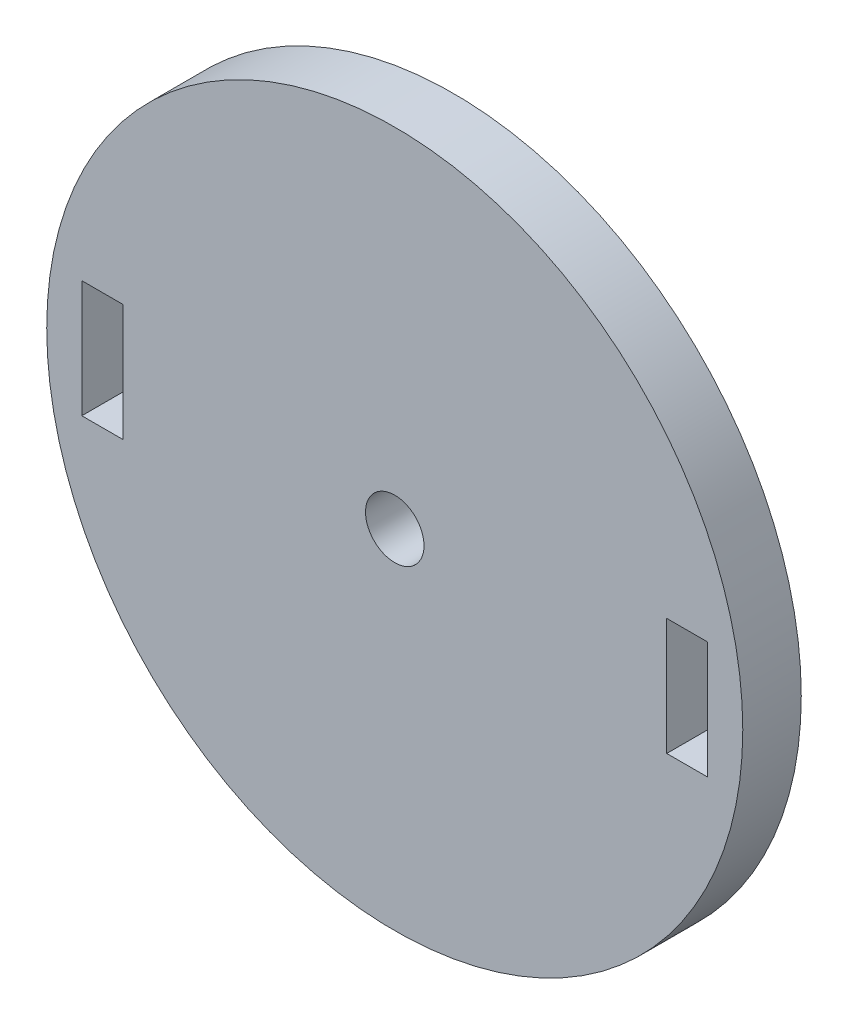
ISO-10303-21;
HEADER;
FILE_DESCRIPTION(('STEP AP214'),'2;1');
FILE_NAME('part.step','',(''),(''),'','','');
FILE_SCHEMA(('AUTOMOTIVE_DESIGN { 1 0 10303 214 1 1 1 1 }'));
ENDSEC;
DATA;
#1=APPLICATION_CONTEXT('core data for automotive mechanical design processes');
#2=APPLICATION_PROTOCOL_DEFINITION('international standard','automotive_design',2000,#1);
#3=PRODUCT_CONTEXT('',#1,'mechanical');
#4=PRODUCT('Part','Part','',(#3));
#5=PRODUCT_RELATED_PRODUCT_CATEGORY('part','',(#4));
#6=PRODUCT_DEFINITION_FORMATION('','',#4);
#7=PRODUCT_DEFINITION_CONTEXT('part definition',#1,'design');
#8=PRODUCT_DEFINITION('design','',#6,#7);
#9=PRODUCT_DEFINITION_SHAPE('','',#8);
#10=(LENGTH_UNIT() NAMED_UNIT(*) SI_UNIT(.MILLI.,.METRE.));
#11=(NAMED_UNIT(*) PLANE_ANGLE_UNIT() SI_UNIT($,.RADIAN.));
#12=(NAMED_UNIT(*) SI_UNIT($,.STERADIAN.) SOLID_ANGLE_UNIT());
#13=UNCERTAINTY_MEASURE_WITH_UNIT(LENGTH_MEASURE(1.E-05),#10,'distance_accuracy_value','');
#14=(GEOMETRIC_REPRESENTATION_CONTEXT(3) GLOBAL_UNCERTAINTY_ASSIGNED_CONTEXT((#13)) GLOBAL_UNIT_ASSIGNED_CONTEXT((#10,
#11,#12)) REPRESENTATION_CONTEXT('',''));
#15=CARTESIAN_POINT('',(0.,0.,0.));
#16=DIRECTION('',(0.,0.,1.));
#17=DIRECTION('',(1.,0.,0.));
#18=AXIS2_PLACEMENT_3D('',#15,#16,#17);
#19=CARTESIAN_POINT('',(0.462805042459808,1.62445089929486,2.));
#20=DIRECTION('',(0.,0.,1.));
#21=DIRECTION('',(1.,0.,0.));
#22=AXIS2_PLACEMENT_3D('',#19,#20,#21);
#23=PLANE('',#22);
#24=CARTESIAN_POINT('',(0.462805042459808,1.62445089929486,2.));
#25=DIRECTION('',(0.,0.,1.));
#26=DIRECTION('',(1.,0.,0.));
#27=AXIS2_PLACEMENT_3D('',#24,#25,#26);
#28=CIRCLE('',#27,11.9);
#29=CARTESIAN_POINT('',(12.3628050424598,1.62445089929486,2.));
#30=VERTEX_POINT('',#29);
#31=EDGE_CURVE('E11',#30,#30,#28,.T.);
#32=ORIENTED_EDGE('',*,*,#31,.T.);
#33=EDGE_LOOP('',(#32));
#34=FACE_BOUND('',#33,.T.);
#35=CARTESIAN_POINT('',(0.462805042459808,1.62445089929486,2.));
#36=DIRECTION('',(0.,0.,1.));
#37=DIRECTION('',(1.,0.,0.));
#38=AXIS2_PLACEMENT_3D('',#35,#36,#37);
#39=CIRCLE('',#38,1.);
#40=CARTESIAN_POINT('',(1.46280504245981,1.62445089929486,2.));
#41=VERTEX_POINT('',#40);
#42=EDGE_CURVE('E196',#41,#41,#39,.T.);
#43=ORIENTED_EDGE('',*,*,#42,.F.);
#44=EDGE_LOOP('',(#43));
#45=FACE_BOUND('',#44,.T.);
#46=DIRECTION('',(1.,0.,0.));
#47=VECTOR('',#46,1.);
#48=CARTESIAN_POINT('',(11.1628050424598,-0.375549100705139,2.));
#49=LINE('',#48,#47);
#50=CARTESIAN_POINT('',(9.76280504245981,-0.375549100705139,2.));
#51=VERTEX_POINT('',#50);
#52=CARTESIAN_POINT('',(11.1628050424598,-0.375549100705139,2.));
#53=VERTEX_POINT('',#52);
#54=EDGE_CURVE('E156',#51,#53,#49,.T.);
#55=ORIENTED_EDGE('',*,*,#54,.F.);
#56=DIRECTION('',(0.,-1.,0.));
#57=VECTOR('',#56,1.);
#58=CARTESIAN_POINT('',(9.76280504245981,3.62445089929486,2.));
#59=LINE('',#58,#57);
#60=CARTESIAN_POINT('',(9.76280504245981,3.62445089929486,2.));
#61=VERTEX_POINT('',#60);
#62=EDGE_CURVE('E153',#61,#51,#59,.T.);
#63=ORIENTED_EDGE('',*,*,#62,.F.);
#64=DIRECTION('',(-1.,0.,0.));
#65=VECTOR('',#64,1.);
#66=CARTESIAN_POINT('',(11.1628050424598,3.62445089929486,2.));
#67=LINE('',#66,#65);
#68=CARTESIAN_POINT('',(11.1628050424598,3.62445089929486,2.));
#69=VERTEX_POINT('',#68);
#70=EDGE_CURVE('E164',#69,#61,#67,.T.);
#71=ORIENTED_EDGE('',*,*,#70,.F.);
#72=DIRECTION('',(0.,1.,0.));
#73=VECTOR('',#72,1.);
#74=CARTESIAN_POINT('',(11.1628050424598,3.62445089929486,2.));
#75=LINE('',#74,#73);
#76=EDGE_CURVE('E160',#53,#69,#75,.T.);
#77=ORIENTED_EDGE('',*,*,#76,.F.);
#78=EDGE_LOOP('',(#55,#63,#71,#77));
#79=FACE_BOUND('',#78,.T.);
#80=DIRECTION('',(1.,0.,0.));
#81=VECTOR('',#80,1.);
#82=CARTESIAN_POINT('',(-10.2371949575402,-0.375549100705139,2.));
#83=LINE('',#82,#81);
#84=CARTESIAN_POINT('',(-10.2371949575402,-0.375549100705139,2.));
#85=VERTEX_POINT('',#84);
#86=CARTESIAN_POINT('',(-8.83719495754019,-0.375549100705139,2.));
#87=VERTEX_POINT('',#86);
#88=EDGE_CURVE('E114',#85,#87,#83,.T.);
#89=ORIENTED_EDGE('',*,*,#88,.F.);
#90=DIRECTION('',(0.,-1.,0.));
#91=VECTOR('',#90,1.);
#92=CARTESIAN_POINT('',(-10.2371949575402,3.62445089929486,2.));
#93=LINE('',#92,#91);
#94=CARTESIAN_POINT('',(-10.2371949575402,3.62445089929486,2.));
#95=VERTEX_POINT('',#94);
#96=EDGE_CURVE('E105',#95,#85,#93,.T.);
#97=ORIENTED_EDGE('',*,*,#96,.F.);
#98=DIRECTION('',(-1.,0.,0.));
#99=VECTOR('',#98,1.);
#100=CARTESIAN_POINT('',(-10.2371949575402,3.62445089929486,2.));
#101=LINE('',#100,#99);
#102=CARTESIAN_POINT('',(-8.83719495754019,3.62445089929486,2.));
#103=VERTEX_POINT('',#102);
#104=EDGE_CURVE('E131',#103,#95,#101,.T.);
#105=ORIENTED_EDGE('',*,*,#104,.F.);
#106=DIRECTION('',(0.,1.,0.));
#107=VECTOR('',#106,1.);
#108=CARTESIAN_POINT('',(-8.83719495754019,3.62445089929486,2.));
#109=LINE('',#108,#107);
#110=EDGE_CURVE('E127',#87,#103,#109,.T.);
#111=ORIENTED_EDGE('',*,*,#110,.F.);
#112=EDGE_LOOP('',(#89,#97,#105,#111));
#113=FACE_BOUND('',#112,.T.);
#114=ADVANCED_FACE('F39',(#34,#45,#79,#113),#23,.T.);
#115=CARTESIAN_POINT('',(0.462805042459808,1.62445089929486,0.));
#116=DIRECTION('',(0.,0.,1.));
#117=DIRECTION('',(1.,0.,0.));
#118=AXIS2_PLACEMENT_3D('',#115,#116,#117);
#119=PLANE('',#118);
#120=DIRECTION('',(0.,-1.,0.));
#121=VECTOR('',#120,1.);
#122=CARTESIAN_POINT('',(9.76280504245981,3.62445089929486,0.));
#123=LINE('',#122,#121);
#124=CARTESIAN_POINT('',(9.76280504245981,3.62445089929486,0.));
#125=VERTEX_POINT('',#124);
#126=CARTESIAN_POINT('',(9.76280504245981,-0.375549100705139,0.));
#127=VERTEX_POINT('',#126);
#128=EDGE_CURVE('E123',#125,#127,#123,.T.);
#129=ORIENTED_EDGE('',*,*,#128,.T.);
#130=DIRECTION('',(1.,0.,0.));
#131=VECTOR('',#130,1.);
#132=CARTESIAN_POINT('',(11.1628050424598,-0.375549100705139,0.));
#133=LINE('',#132,#131);
#134=CARTESIAN_POINT('',(11.1628050424598,-0.375549100705139,0.));
#135=VERTEX_POINT('',#134);
#136=EDGE_CURVE('E171',#127,#135,#133,.T.);
#137=ORIENTED_EDGE('',*,*,#136,.T.);
#138=DIRECTION('',(0.,1.,0.));
#139=VECTOR('',#138,1.);
#140=CARTESIAN_POINT('',(11.1628050424598,3.62445089929486,0.));
#141=LINE('',#140,#139);
#142=CARTESIAN_POINT('',(11.1628050424598,3.62445089929486,0.));
#143=VERTEX_POINT('',#142);
#144=EDGE_CURVE('E175',#135,#143,#141,.T.);
#145=ORIENTED_EDGE('',*,*,#144,.T.);
#146=DIRECTION('',(-1.,0.,0.));
#147=VECTOR('',#146,1.);
#148=CARTESIAN_POINT('',(11.1628050424598,3.62445089929486,0.));
#149=LINE('',#148,#147);
#150=EDGE_CURVE('E157',#143,#125,#149,.T.);
#151=ORIENTED_EDGE('',*,*,#150,.T.);
#152=EDGE_LOOP('',(#129,#137,#145,#151));
#153=FACE_BOUND('',#152,.T.);
#154=CARTESIAN_POINT('',(0.462805042459808,1.62445089929486,0.));
#155=DIRECTION('',(0.,0.,1.));
#156=DIRECTION('',(1.,0.,0.));
#157=AXIS2_PLACEMENT_3D('',#154,#155,#156);
#158=CIRCLE('',#157,11.9);
#159=CARTESIAN_POINT('',(12.3628050424598,1.62445089929486,0.));
#160=VERTEX_POINT('',#159);
#161=EDGE_CURVE('E43',#160,#160,#158,.T.);
#162=ORIENTED_EDGE('',*,*,#161,.F.);
#163=EDGE_LOOP('',(#162));
#164=FACE_BOUND('',#163,.T.);
#165=CARTESIAN_POINT('',(0.462805042459808,1.62445089929486,0.));
#166=DIRECTION('',(0.,0.,1.));
#167=DIRECTION('',(1.,0.,0.));
#168=AXIS2_PLACEMENT_3D('',#165,#166,#167);
#169=CIRCLE('',#168,1.);
#170=CARTESIAN_POINT('',(1.46280504245981,1.62445089929486,0.));
#171=VERTEX_POINT('',#170);
#172=EDGE_CURVE('E195',#171,#171,#169,.T.);
#173=ORIENTED_EDGE('',*,*,#172,.T.);
#174=EDGE_LOOP('',(#173));
#175=FACE_BOUND('',#174,.T.);
#176=DIRECTION('',(0.,-1.,0.));
#177=VECTOR('',#176,1.);
#178=CARTESIAN_POINT('',(-10.2371949575402,3.62445089929486,0.));
#179=LINE('',#178,#177);
#180=CARTESIAN_POINT('',(-10.2371949575402,3.62445089929486,0.));
#181=VERTEX_POINT('',#180);
#182=CARTESIAN_POINT('',(-10.2371949575402,-0.375549100705139,0.));
#183=VERTEX_POINT('',#182);
#184=EDGE_CURVE('E63',#181,#183,#179,.T.);
#185=ORIENTED_EDGE('',*,*,#184,.T.);
#186=DIRECTION('',(1.,0.,0.));
#187=VECTOR('',#186,1.);
#188=CARTESIAN_POINT('',(-10.2371949575402,-0.375549100705139,0.));
#189=LINE('',#188,#187);
#190=CARTESIAN_POINT('',(-8.83719495754019,-0.375549100705139,0.));
#191=VERTEX_POINT('',#190);
#192=EDGE_CURVE('E121',#183,#191,#189,.T.);
#193=ORIENTED_EDGE('',*,*,#192,.T.);
#194=DIRECTION('',(0.,1.,0.));
#195=VECTOR('',#194,1.);
#196=CARTESIAN_POINT('',(-8.83719495754019,3.62445089929486,0.));
#197=LINE('',#196,#195);
#198=CARTESIAN_POINT('',(-8.83719495754019,3.62445089929486,0.));
#199=VERTEX_POINT('',#198);
#200=EDGE_CURVE('E140',#191,#199,#197,.T.);
#201=ORIENTED_EDGE('',*,*,#200,.T.);
#202=DIRECTION('',(-1.,0.,0.));
#203=VECTOR('',#202,1.);
#204=CARTESIAN_POINT('',(-10.2371949575402,3.62445089929486,0.));
#205=LINE('',#204,#203);
#206=EDGE_CURVE('E115',#199,#181,#205,.T.);
#207=ORIENTED_EDGE('',*,*,#206,.T.);
#208=EDGE_LOOP('',(#185,#193,#201,#207));
#209=FACE_BOUND('',#208,.T.);
#210=ADVANCED_FACE('F204',(#153,#164,#175,#209),#119,.F.);
#211=CARTESIAN_POINT('',(0.462805042459808,1.62445089929486,2.));
#212=DIRECTION('',(0.,0.,-1.));
#213=DIRECTION('',(-1.,0.,0.));
#214=AXIS2_PLACEMENT_3D('',#211,#212,#213);
#215=CYLINDRICAL_SURFACE('',#214,11.9);
#216=ORIENTED_EDGE('',*,*,#31,.F.);
#217=EDGE_LOOP('',(#216));
#218=FACE_BOUND('',#217,.T.);
#219=ORIENTED_EDGE('',*,*,#161,.T.);
#220=EDGE_LOOP('',(#219));
#221=FACE_BOUND('',#220,.T.);
#222=ADVANCED_FACE('F41',(#218,#221),#215,.T.);
#223=CARTESIAN_POINT('',(0.462805042459808,1.62445089929486,2.));
#224=DIRECTION('',(0.,0.,-1.));
#225=DIRECTION('',(-1.,0.,0.));
#226=AXIS2_PLACEMENT_3D('',#223,#224,#225);
#227=CYLINDRICAL_SURFACE('',#226,1.);
#228=ORIENTED_EDGE('',*,*,#42,.T.);
#229=EDGE_LOOP('',(#228));
#230=FACE_BOUND('',#229,.T.);
#231=ORIENTED_EDGE('',*,*,#172,.F.);
#232=EDGE_LOOP('',(#231));
#233=FACE_BOUND('',#232,.T.);
#234=ADVANCED_FACE('F207',(#230,#233),#227,.F.);
#235=CARTESIAN_POINT('',(9.76280504245981,3.62445089929486,2.));
#236=DIRECTION('',(1.,0.,0.));
#237=DIRECTION('',(0.,0.,-1.));
#238=AXIS2_PLACEMENT_3D('',#235,#236,#237);
#239=PLANE('',#238);
#240=ORIENTED_EDGE('',*,*,#128,.F.);
#241=DIRECTION('',(0.,0.,-1.));
#242=VECTOR('',#241,1.);
#243=CARTESIAN_POINT('',(9.76280504245981,3.62445089929486,2.));
#244=LINE('',#243,#242);
#245=EDGE_CURVE('E167',#61,#125,#244,.T.);
#246=ORIENTED_EDGE('',*,*,#245,.F.);
#247=ORIENTED_EDGE('',*,*,#62,.T.);
#248=DIRECTION('',(0.,0.,-1.));
#249=VECTOR('',#248,1.);
#250=CARTESIAN_POINT('',(9.76280504245981,-0.375549100705139,2.));
#251=LINE('',#250,#249);
#252=EDGE_CURVE('E191',#51,#127,#251,.T.);
#253=ORIENTED_EDGE('',*,*,#252,.T.);
#254=EDGE_LOOP('',(#240,#246,#247,#253));
#255=FACE_BOUND('',#254,.T.);
#256=ADVANCED_FACE('F209',(#255),#239,.T.);
#257=CARTESIAN_POINT('',(11.1628050424598,-0.375549100705139,2.));
#258=DIRECTION('',(0.,1.,0.));
#259=DIRECTION('',(-1.,0.,0.));
#260=AXIS2_PLACEMENT_3D('',#257,#258,#259);
#261=PLANE('',#260);
#262=ORIENTED_EDGE('',*,*,#136,.F.);
#263=ORIENTED_EDGE('',*,*,#252,.F.);
#264=ORIENTED_EDGE('',*,*,#54,.T.);
#265=DIRECTION('',(0.,0.,-1.));
#266=VECTOR('',#265,1.);
#267=CARTESIAN_POINT('',(11.1628050424598,-0.375549100705139,2.));
#268=LINE('',#267,#266);
#269=EDGE_CURVE('E188',#53,#135,#268,.T.);
#270=ORIENTED_EDGE('',*,*,#269,.T.);
#271=EDGE_LOOP('',(#262,#263,#264,#270));
#272=FACE_BOUND('',#271,.T.);
#273=ADVANCED_FACE('F216',(#272),#261,.T.);
#274=CARTESIAN_POINT('',(11.1628050424598,3.62445089929486,2.));
#275=DIRECTION('',(-1.,0.,0.));
#276=DIRECTION('',(0.,0.,1.));
#277=AXIS2_PLACEMENT_3D('',#274,#275,#276);
#278=PLANE('',#277);
#279=ORIENTED_EDGE('',*,*,#144,.F.);
#280=ORIENTED_EDGE('',*,*,#269,.F.);
#281=ORIENTED_EDGE('',*,*,#76,.T.);
#282=DIRECTION('',(0.,0.,-1.));
#283=VECTOR('',#282,1.);
#284=CARTESIAN_POINT('',(11.1628050424598,3.62445089929486,2.));
#285=LINE('',#284,#283);
#286=EDGE_CURVE('E185',#69,#143,#285,.T.);
#287=ORIENTED_EDGE('',*,*,#286,.T.);
#288=EDGE_LOOP('',(#279,#280,#281,#287));
#289=FACE_BOUND('',#288,.T.);
#290=ADVANCED_FACE('F240',(#289),#278,.T.);
#291=CARTESIAN_POINT('',(11.1628050424598,3.62445089929486,2.));
#292=DIRECTION('',(0.,-1.,0.));
#293=DIRECTION('',(1.,0.,0.));
#294=AXIS2_PLACEMENT_3D('',#291,#292,#293);
#295=PLANE('',#294);
#296=ORIENTED_EDGE('',*,*,#150,.F.);
#297=ORIENTED_EDGE('',*,*,#286,.F.);
#298=ORIENTED_EDGE('',*,*,#70,.T.);
#299=ORIENTED_EDGE('',*,*,#245,.T.);
#300=EDGE_LOOP('',(#296,#297,#298,#299));
#301=FACE_BOUND('',#300,.T.);
#302=ADVANCED_FACE('F245',(#301),#295,.T.);
#303=CARTESIAN_POINT('',(-10.2371949575402,3.62445089929486,2.));
#304=DIRECTION('',(1.,0.,0.));
#305=DIRECTION('',(0.,0.,-1.));
#306=AXIS2_PLACEMENT_3D('',#303,#304,#305);
#307=PLANE('',#306);
#308=ORIENTED_EDGE('',*,*,#184,.F.);
#309=DIRECTION('',(0.,0.,-1.));
#310=VECTOR('',#309,1.);
#311=CARTESIAN_POINT('',(-10.2371949575402,3.62445089929486,2.));
#312=LINE('',#311,#310);
#313=EDGE_CURVE('E109',#95,#181,#312,.T.);
#314=ORIENTED_EDGE('',*,*,#313,.F.);
#315=ORIENTED_EDGE('',*,*,#96,.T.);
#316=DIRECTION('',(0.,0.,-1.));
#317=VECTOR('',#316,1.);
#318=CARTESIAN_POINT('',(-10.2371949575402,-0.375549100705139,2.));
#319=LINE('',#318,#317);
#320=EDGE_CURVE('E108',#85,#183,#319,.T.);
#321=ORIENTED_EDGE('',*,*,#320,.T.);
#322=EDGE_LOOP('',(#308,#314,#315,#321));
#323=FACE_BOUND('',#322,.T.);
#324=ADVANCED_FACE('F107',(#323),#307,.T.);
#325=CARTESIAN_POINT('',(-10.2371949575402,-0.375549100705139,2.));
#326=DIRECTION('',(0.,1.,0.));
#327=DIRECTION('',(-1.,0.,0.));
#328=AXIS2_PLACEMENT_3D('',#325,#326,#327);
#329=PLANE('',#328);
#330=ORIENTED_EDGE('',*,*,#192,.F.);
#331=ORIENTED_EDGE('',*,*,#320,.F.);
#332=ORIENTED_EDGE('',*,*,#88,.T.);
#333=DIRECTION('',(0.,0.,-1.));
#334=VECTOR('',#333,1.);
#335=CARTESIAN_POINT('',(-8.83719495754019,-0.375549100705139,2.));
#336=LINE('',#335,#334);
#337=EDGE_CURVE('E124',#87,#191,#336,.T.);
#338=ORIENTED_EDGE('',*,*,#337,.T.);
#339=EDGE_LOOP('',(#330,#331,#332,#338));
#340=FACE_BOUND('',#339,.T.);
#341=ADVANCED_FACE('F118',(#340),#329,.T.);
#342=CARTESIAN_POINT('',(-8.83719495754019,3.62445089929486,2.));
#343=DIRECTION('',(-1.,0.,0.));
#344=DIRECTION('',(0.,0.,1.));
#345=AXIS2_PLACEMENT_3D('',#342,#343,#344);
#346=PLANE('',#345);
#347=ORIENTED_EDGE('',*,*,#200,.F.);
#348=ORIENTED_EDGE('',*,*,#337,.F.);
#349=ORIENTED_EDGE('',*,*,#110,.T.);
#350=DIRECTION('',(0.,0.,-1.));
#351=VECTOR('',#350,1.);
#352=CARTESIAN_POINT('',(-8.83719495754019,3.62445089929486,2.));
#353=LINE('',#352,#351);
#354=EDGE_CURVE('E55',#103,#199,#353,.T.);
#355=ORIENTED_EDGE('',*,*,#354,.T.);
#356=EDGE_LOOP('',(#347,#348,#349,#355));
#357=FACE_BOUND('',#356,.T.);
#358=ADVANCED_FACE('F284',(#357),#346,.T.);
#359=CARTESIAN_POINT('',(-10.2371949575402,3.62445089929486,2.));
#360=DIRECTION('',(0.,-1.,0.));
#361=DIRECTION('',(1.,0.,0.));
#362=AXIS2_PLACEMENT_3D('',#359,#360,#361);
#363=PLANE('',#362);
#364=ORIENTED_EDGE('',*,*,#206,.F.);
#365=ORIENTED_EDGE('',*,*,#354,.F.);
#366=ORIENTED_EDGE('',*,*,#104,.T.);
#367=ORIENTED_EDGE('',*,*,#313,.T.);
#368=EDGE_LOOP('',(#364,#365,#366,#367));
#369=FACE_BOUND('',#368,.T.);
#370=ADVANCED_FACE('F292',(#369),#363,.T.);
#371=CLOSED_SHELL('',(#114,#210,#222,#234,#256,#273,#290,#302,#324,#341,#358,#370));
#372=MANIFOLD_SOLID_BREP('B2',#371);
#373=ADVANCED_BREP_SHAPE_REPRESENTATION('',(#18,#372),#14);
#374=SHAPE_DEFINITION_REPRESENTATION(#9,#373);
ENDSEC;
END-ISO-10303-21;
